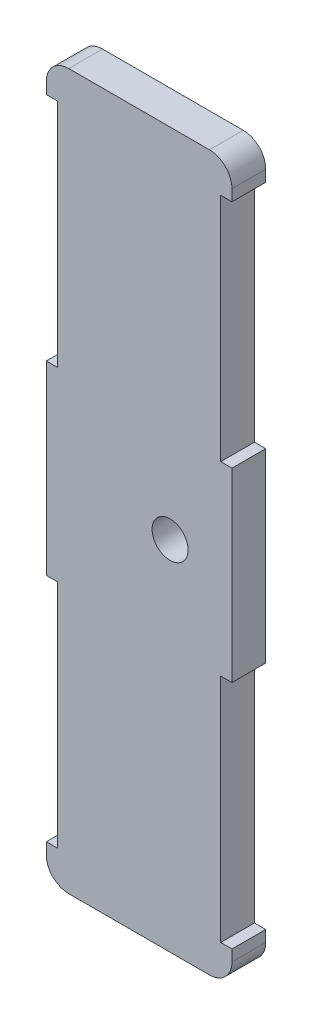
ISO-10303-21;
HEADER;
FILE_DESCRIPTION(('STEP AP214'),'2;1');
FILE_NAME('part.step','',(''),(''),'','','');
FILE_SCHEMA(('AUTOMOTIVE_DESIGN { 1 0 10303 214 1 1 1 1 }'));
ENDSEC;
DATA;
#1=APPLICATION_CONTEXT('core data for automotive mechanical design processes');
#2=APPLICATION_PROTOCOL_DEFINITION('international standard','automotive_design',2000,#1);
#3=PRODUCT_CONTEXT('',#1,'mechanical');
#4=PRODUCT('Part','Part','',(#3));
#5=PRODUCT_RELATED_PRODUCT_CATEGORY('part','',(#4));
#6=PRODUCT_DEFINITION_FORMATION('','',#4);
#7=PRODUCT_DEFINITION_CONTEXT('part definition',#1,'design');
#8=PRODUCT_DEFINITION('design','',#6,#7);
#9=PRODUCT_DEFINITION_SHAPE('','',#8);
#10=(LENGTH_UNIT() NAMED_UNIT(*) SI_UNIT(.MILLI.,.METRE.));
#11=(NAMED_UNIT(*) PLANE_ANGLE_UNIT() SI_UNIT($,.RADIAN.));
#12=(NAMED_UNIT(*) SI_UNIT($,.STERADIAN.) SOLID_ANGLE_UNIT());
#13=UNCERTAINTY_MEASURE_WITH_UNIT(LENGTH_MEASURE(1.E-05),#10,'distance_accuracy_value','');
#14=(GEOMETRIC_REPRESENTATION_CONTEXT(3) GLOBAL_UNCERTAINTY_ASSIGNED_CONTEXT((#13)) GLOBAL_UNIT_ASSIGNED_CONTEXT((#10,
#11,#12)) REPRESENTATION_CONTEXT('',''));
#15=CARTESIAN_POINT('',(0.,0.,0.));
#16=DIRECTION('',(0.,0.,1.));
#17=DIRECTION('',(1.,0.,0.));
#18=AXIS2_PLACEMENT_3D('',#15,#16,#17);
#19=CARTESIAN_POINT('',(0.,0.,3.));
#20=DIRECTION('',(0.,0.,-1.));
#21=DIRECTION('',(-1.,0.,0.));
#22=AXIS2_PLACEMENT_3D('',#19,#20,#21);
#23=PLANE('',#22);
#24=DIRECTION('',(-1.,0.,0.));
#25=VECTOR('',#24,1.);
#26=CARTESIAN_POINT('',(-61.,31.75,3.));
#27=LINE('',#26,#25);
#28=CARTESIAN_POINT('',(-46.5,31.75,3.));
#29=VERTEX_POINT('',#28);
#30=CARTESIAN_POINT('',(-59.,31.75,3.));
#31=VERTEX_POINT('',#30);
#32=EDGE_CURVE('E204',#29,#31,#27,.T.);
#33=ORIENTED_EDGE('',*,*,#32,.T.);
#34=CARTESIAN_POINT('',(-59.,29.75,3.));
#35=DIRECTION('',(0.,0.,-1.));
#36=DIRECTION('',(-1.,0.,0.));
#37=AXIS2_PLACEMENT_3D('',#34,#35,#36);
#38=CIRCLE('',#37,2.);
#39=CARTESIAN_POINT('',(-61.,29.75,3.));
#40=VERTEX_POINT('',#39);
#41=EDGE_CURVE('E200',#31,#40,#38,.F.);
#42=ORIENTED_EDGE('',*,*,#41,.T.);
#43=DIRECTION('',(0.,-1.,0.));
#44=VECTOR('',#43,1.);
#45=CARTESIAN_POINT('',(-61.,28.75,3.));
#46=LINE('',#45,#44);
#47=CARTESIAN_POINT('',(-61.,28.75,3.));
#48=VERTEX_POINT('',#47);
#49=EDGE_CURVE('E192',#40,#48,#46,.T.);
#50=ORIENTED_EDGE('',*,*,#49,.T.);
#51=DIRECTION('',(1.,0.,0.));
#52=VECTOR('',#51,1.);
#53=CARTESIAN_POINT('',(-61.,28.75,3.));
#54=LINE('',#53,#52);
#55=CARTESIAN_POINT('',(-60.,28.75,3.));
#56=VERTEX_POINT('',#55);
#57=EDGE_CURVE('E197',#48,#56,#54,.T.);
#58=ORIENTED_EDGE('',*,*,#57,.T.);
#59=DIRECTION('',(0.,-1.,0.));
#60=VECTOR('',#59,1.);
#61=CARTESIAN_POINT('',(-60.,28.75,3.));
#62=LINE('',#61,#60);
#63=CARTESIAN_POINT('',(-60.,8.25,3.));
#64=VERTEX_POINT('',#63);
#65=EDGE_CURVE('E219',#56,#64,#62,.T.);
#66=ORIENTED_EDGE('',*,*,#65,.T.);
#67=DIRECTION('',(-1.,0.,0.));
#68=VECTOR('',#67,1.);
#69=CARTESIAN_POINT('',(-60.,8.25,3.));
#70=LINE('',#69,#68);
#71=CARTESIAN_POINT('',(-61.,8.25,3.));
#72=VERTEX_POINT('',#71);
#73=EDGE_CURVE('E221',#64,#72,#70,.T.);
#74=ORIENTED_EDGE('',*,*,#73,.T.);
#75=DIRECTION('',(0.,-1.,0.));
#76=VECTOR('',#75,1.);
#77=CARTESIAN_POINT('',(-61.,-8.25,3.));
#78=LINE('',#77,#76);
#79=CARTESIAN_POINT('',(-61.,-8.25,3.));
#80=VERTEX_POINT('',#79);
#81=EDGE_CURVE('E226',#72,#80,#78,.T.);
#82=ORIENTED_EDGE('',*,*,#81,.T.);
#83=DIRECTION('',(1.,0.,0.));
#84=VECTOR('',#83,1.);
#85=CARTESIAN_POINT('',(-61.,-8.25,3.));
#86=LINE('',#85,#84);
#87=CARTESIAN_POINT('',(-60.,-8.25,3.));
#88=VERTEX_POINT('',#87);
#89=EDGE_CURVE('E228',#80,#88,#86,.T.);
#90=ORIENTED_EDGE('',*,*,#89,.T.);
#91=DIRECTION('',(0.,-1.,0.));
#92=VECTOR('',#91,1.);
#93=CARTESIAN_POINT('',(-60.,-8.25,3.));
#94=LINE('',#93,#92);
#95=CARTESIAN_POINT('',(-60.,-28.75,3.));
#96=VERTEX_POINT('',#95);
#97=EDGE_CURVE('E230',#88,#96,#94,.T.);
#98=ORIENTED_EDGE('',*,*,#97,.T.);
#99=DIRECTION('',(-1.,0.,0.));
#100=VECTOR('',#99,1.);
#101=CARTESIAN_POINT('',(-60.,-28.75,3.));
#102=LINE('',#101,#100);
#103=CARTESIAN_POINT('',(-61.,-28.75,3.));
#104=VERTEX_POINT('',#103);
#105=EDGE_CURVE('E232',#96,#104,#102,.T.);
#106=ORIENTED_EDGE('',*,*,#105,.T.);
#107=DIRECTION('',(0.,-1.,0.));
#108=VECTOR('',#107,1.);
#109=CARTESIAN_POINT('',(-61.,-31.75,3.));
#110=LINE('',#109,#108);
#111=CARTESIAN_POINT('',(-61.,-29.75,3.));
#112=VERTEX_POINT('',#111);
#113=EDGE_CURVE('E234',#104,#112,#110,.T.);
#114=ORIENTED_EDGE('',*,*,#113,.T.);
#115=CARTESIAN_POINT('',(-59.,-29.75,3.));
#116=DIRECTION('',(0.,0.,-1.));
#117=DIRECTION('',(-1.,0.,0.));
#118=AXIS2_PLACEMENT_3D('',#115,#116,#117);
#119=CIRCLE('',#118,2.);
#120=CARTESIAN_POINT('',(-59.,-31.75,3.));
#121=VERTEX_POINT('',#120);
#122=EDGE_CURVE('E356',#112,#121,#119,.F.);
#123=ORIENTED_EDGE('',*,*,#122,.T.);
#124=DIRECTION('',(1.,0.,0.));
#125=VECTOR('',#124,1.);
#126=CARTESIAN_POINT('',(-44.5,-31.75,3.));
#127=LINE('',#126,#125);
#128=CARTESIAN_POINT('',(-46.5,-31.75,3.));
#129=VERTEX_POINT('',#128);
#130=EDGE_CURVE('E237',#121,#129,#127,.T.);
#131=ORIENTED_EDGE('',*,*,#130,.T.);
#132=CARTESIAN_POINT('',(-46.5,-29.75,3.));
#133=DIRECTION('',(0.,0.,-1.));
#134=DIRECTION('',(-1.,0.,0.));
#135=AXIS2_PLACEMENT_3D('',#132,#133,#134);
#136=CIRCLE('',#135,2.);
#137=CARTESIAN_POINT('',(-44.5,-29.75,3.));
#138=VERTEX_POINT('',#137);
#139=EDGE_CURVE('E48',#129,#138,#136,.F.);
#140=ORIENTED_EDGE('',*,*,#139,.T.);
#141=DIRECTION('',(0.,1.,0.));
#142=VECTOR('',#141,1.);
#143=CARTESIAN_POINT('',(-44.5,-28.75,3.));
#144=LINE('',#143,#142);
#145=CARTESIAN_POINT('',(-44.5,-28.75,3.));
#146=VERTEX_POINT('',#145);
#147=EDGE_CURVE('E239',#138,#146,#144,.T.);
#148=ORIENTED_EDGE('',*,*,#147,.T.);
#149=DIRECTION('',(-1.,0.,0.));
#150=VECTOR('',#149,1.);
#151=CARTESIAN_POINT('',(-45.5,-28.75,3.));
#152=LINE('',#151,#150);
#153=CARTESIAN_POINT('',(-45.5,-28.75,3.));
#154=VERTEX_POINT('',#153);
#155=EDGE_CURVE('E241',#146,#154,#152,.T.);
#156=ORIENTED_EDGE('',*,*,#155,.T.);
#157=DIRECTION('',(0.,1.,0.));
#158=VECTOR('',#157,1.);
#159=CARTESIAN_POINT('',(-45.5,-8.25,3.));
#160=LINE('',#159,#158);
#161=CARTESIAN_POINT('',(-45.5,-8.25,3.));
#162=VERTEX_POINT('',#161);
#163=EDGE_CURVE('E243',#154,#162,#160,.T.);
#164=ORIENTED_EDGE('',*,*,#163,.T.);
#165=DIRECTION('',(1.,0.,0.));
#166=VECTOR('',#165,1.);
#167=CARTESIAN_POINT('',(-44.5,-8.25,3.));
#168=LINE('',#167,#166);
#169=CARTESIAN_POINT('',(-44.5,-8.25,3.));
#170=VERTEX_POINT('',#169);
#171=EDGE_CURVE('E245',#162,#170,#168,.T.);
#172=ORIENTED_EDGE('',*,*,#171,.T.);
#173=DIRECTION('',(0.,1.,0.));
#174=VECTOR('',#173,1.);
#175=CARTESIAN_POINT('',(-44.5,8.25,3.));
#176=LINE('',#175,#174);
#177=CARTESIAN_POINT('',(-44.5,8.25,3.));
#178=VERTEX_POINT('',#177);
#179=EDGE_CURVE('E247',#170,#178,#176,.T.);
#180=ORIENTED_EDGE('',*,*,#179,.T.);
#181=DIRECTION('',(-1.,0.,0.));
#182=VECTOR('',#181,1.);
#183=CARTESIAN_POINT('',(-45.5,8.25,3.));
#184=LINE('',#183,#182);
#185=CARTESIAN_POINT('',(-45.5,8.25,3.));
#186=VERTEX_POINT('',#185);
#187=EDGE_CURVE('E249',#178,#186,#184,.T.);
#188=ORIENTED_EDGE('',*,*,#187,.T.);
#189=DIRECTION('',(0.,1.,0.));
#190=VECTOR('',#189,1.);
#191=CARTESIAN_POINT('',(-45.5,28.75,3.));
#192=LINE('',#191,#190);
#193=CARTESIAN_POINT('',(-45.5,28.75,3.));
#194=VERTEX_POINT('',#193);
#195=EDGE_CURVE('E251',#186,#194,#192,.T.);
#196=ORIENTED_EDGE('',*,*,#195,.T.);
#197=DIRECTION('',(1.,0.,0.));
#198=VECTOR('',#197,1.);
#199=CARTESIAN_POINT('',(-45.5,28.75,3.));
#200=LINE('',#199,#198);
#201=CARTESIAN_POINT('',(-44.5,28.75,3.));
#202=VERTEX_POINT('',#201);
#203=EDGE_CURVE('E253',#194,#202,#200,.T.);
#204=ORIENTED_EDGE('',*,*,#203,.T.);
#205=DIRECTION('',(0.,1.,0.));
#206=VECTOR('',#205,1.);
#207=CARTESIAN_POINT('',(-44.5,28.75,3.));
#208=LINE('',#207,#206);
#209=CARTESIAN_POINT('',(-44.5,29.75,3.));
#210=VERTEX_POINT('',#209);
#211=EDGE_CURVE('E299',#202,#210,#208,.T.);
#212=ORIENTED_EDGE('',*,*,#211,.T.);
#213=CARTESIAN_POINT('',(-46.5,29.75,3.));
#214=DIRECTION('',(0.,0.,-1.));
#215=DIRECTION('',(-1.,0.,0.));
#216=AXIS2_PLACEMENT_3D('',#213,#214,#215);
#217=CIRCLE('',#216,2.);
#218=EDGE_CURVE('E359',#210,#29,#217,.F.);
#219=ORIENTED_EDGE('',*,*,#218,.T.);
#220=EDGE_LOOP('',(#33,#42,#50,#58,#66,#74,#82,#90,#98,#106,#114,#123,#131,#140,#148,#156,#164,
#172,#180,#188,#196,#204,#212,#219));
#221=FACE_BOUND('',#220,.T.);
#222=CARTESIAN_POINT('',(-50.,0.,3.));
#223=DIRECTION('',(0.,0.,1.));
#224=DIRECTION('',(1.,0.,0.));
#225=AXIS2_PLACEMENT_3D('',#222,#223,#224);
#226=CIRCLE('',#225,1.60000000000001);
#227=CARTESIAN_POINT('',(-48.4,0.,3.));
#228=VERTEX_POINT('',#227);
#229=EDGE_CURVE('E260',#228,#228,#226,.T.);
#230=ORIENTED_EDGE('',*,*,#229,.F.);
#231=EDGE_LOOP('',(#230));
#232=FACE_BOUND('',#231,.T.);
#233=ADVANCED_FACE('F33',(#221,#232),#23,.F.);
#234=CARTESIAN_POINT('',(0.,0.,0.));
#235=DIRECTION('',(0.,0.,-1.));
#236=DIRECTION('',(-1.,0.,0.));
#237=AXIS2_PLACEMENT_3D('',#234,#235,#236);
#238=PLANE('',#237);
#239=DIRECTION('',(0.,-1.,0.));
#240=VECTOR('',#239,1.);
#241=CARTESIAN_POINT('',(-61.,28.75,0.));
#242=LINE('',#241,#240);
#243=CARTESIAN_POINT('',(-61.,29.75,0.));
#244=VERTEX_POINT('',#243);
#245=CARTESIAN_POINT('',(-61.,28.75,0.));
#246=VERTEX_POINT('',#245);
#247=EDGE_CURVE('E210',#244,#246,#242,.T.);
#248=ORIENTED_EDGE('',*,*,#247,.F.);
#249=CARTESIAN_POINT('',(-59.,29.75,0.));
#250=DIRECTION('',(0.,0.,-1.));
#251=DIRECTION('',(-1.,0.,0.));
#252=AXIS2_PLACEMENT_3D('',#249,#250,#251);
#253=CIRCLE('',#252,2.);
#254=CARTESIAN_POINT('',(-59.,31.75,0.));
#255=VERTEX_POINT('',#254);
#256=EDGE_CURVE('E349',#244,#255,#253,.T.);
#257=ORIENTED_EDGE('',*,*,#256,.T.);
#258=DIRECTION('',(-1.,0.,0.));
#259=VECTOR('',#258,1.);
#260=CARTESIAN_POINT('',(-61.,31.75,0.));
#261=LINE('',#260,#259);
#262=CARTESIAN_POINT('',(-46.5,31.75,0.));
#263=VERTEX_POINT('',#262);
#264=EDGE_CURVE('E259',#263,#255,#261,.T.);
#265=ORIENTED_EDGE('',*,*,#264,.F.);
#266=CARTESIAN_POINT('',(-46.5,29.75,0.));
#267=DIRECTION('',(0.,0.,-1.));
#268=DIRECTION('',(-1.,0.,0.));
#269=AXIS2_PLACEMENT_3D('',#266,#267,#268);
#270=CIRCLE('',#269,2.);
#271=CARTESIAN_POINT('',(-44.5,29.75,0.));
#272=VERTEX_POINT('',#271);
#273=EDGE_CURVE('E347',#263,#272,#270,.T.);
#274=ORIENTED_EDGE('',*,*,#273,.T.);
#275=DIRECTION('',(0.,1.,0.));
#276=VECTOR('',#275,1.);
#277=CARTESIAN_POINT('',(-44.5,28.75,0.));
#278=LINE('',#277,#276);
#279=CARTESIAN_POINT('',(-44.5,28.75,0.));
#280=VERTEX_POINT('',#279);
#281=EDGE_CURVE('E256',#280,#272,#278,.T.);
#282=ORIENTED_EDGE('',*,*,#281,.F.);
#283=DIRECTION('',(1.,0.,0.));
#284=VECTOR('',#283,1.);
#285=CARTESIAN_POINT('',(-45.5,28.75,0.));
#286=LINE('',#285,#284);
#287=CARTESIAN_POINT('',(-45.5,28.75,0.));
#288=VERTEX_POINT('',#287);
#289=EDGE_CURVE('E297',#288,#280,#286,.T.);
#290=ORIENTED_EDGE('',*,*,#289,.F.);
#291=DIRECTION('',(0.,1.,0.));
#292=VECTOR('',#291,1.);
#293=CARTESIAN_POINT('',(-45.5,28.75,0.));
#294=LINE('',#293,#292);
#295=CARTESIAN_POINT('',(-45.5,8.25,0.));
#296=VERTEX_POINT('',#295);
#297=EDGE_CURVE('E295',#296,#288,#294,.T.);
#298=ORIENTED_EDGE('',*,*,#297,.F.);
#299=DIRECTION('',(-1.,0.,0.));
#300=VECTOR('',#299,1.);
#301=CARTESIAN_POINT('',(-45.5,8.25,0.));
#302=LINE('',#301,#300);
#303=CARTESIAN_POINT('',(-44.5,8.25,0.));
#304=VERTEX_POINT('',#303);
#305=EDGE_CURVE('E293',#304,#296,#302,.T.);
#306=ORIENTED_EDGE('',*,*,#305,.F.);
#307=DIRECTION('',(0.,1.,0.));
#308=VECTOR('',#307,1.);
#309=CARTESIAN_POINT('',(-44.5,8.25,0.));
#310=LINE('',#309,#308);
#311=CARTESIAN_POINT('',(-44.5,-8.25,0.));
#312=VERTEX_POINT('',#311);
#313=EDGE_CURVE('E291',#312,#304,#310,.T.);
#314=ORIENTED_EDGE('',*,*,#313,.F.);
#315=DIRECTION('',(1.,0.,0.));
#316=VECTOR('',#315,1.);
#317=CARTESIAN_POINT('',(-44.5,-8.25,0.));
#318=LINE('',#317,#316);
#319=CARTESIAN_POINT('',(-45.5,-8.25,0.));
#320=VERTEX_POINT('',#319);
#321=EDGE_CURVE('E289',#320,#312,#318,.T.);
#322=ORIENTED_EDGE('',*,*,#321,.F.);
#323=DIRECTION('',(0.,1.,0.));
#324=VECTOR('',#323,1.);
#325=CARTESIAN_POINT('',(-45.5,-8.25,0.));
#326=LINE('',#325,#324);
#327=CARTESIAN_POINT('',(-45.5,-28.75,0.));
#328=VERTEX_POINT('',#327);
#329=EDGE_CURVE('E287',#328,#320,#326,.T.);
#330=ORIENTED_EDGE('',*,*,#329,.F.);
#331=DIRECTION('',(-1.,0.,0.));
#332=VECTOR('',#331,1.);
#333=CARTESIAN_POINT('',(-45.5,-28.75,0.));
#334=LINE('',#333,#332);
#335=CARTESIAN_POINT('',(-44.5,-28.75,0.));
#336=VERTEX_POINT('',#335);
#337=EDGE_CURVE('E285',#336,#328,#334,.T.);
#338=ORIENTED_EDGE('',*,*,#337,.F.);
#339=DIRECTION('',(0.,1.,0.));
#340=VECTOR('',#339,1.);
#341=CARTESIAN_POINT('',(-44.5,-28.75,0.));
#342=LINE('',#341,#340);
#343=CARTESIAN_POINT('',(-44.5,-29.75,0.));
#344=VERTEX_POINT('',#343);
#345=EDGE_CURVE('E283',#344,#336,#342,.T.);
#346=ORIENTED_EDGE('',*,*,#345,.F.);
#347=CARTESIAN_POINT('',(-46.5,-29.75,0.));
#348=DIRECTION('',(0.,0.,-1.));
#349=DIRECTION('',(-1.,0.,0.));
#350=AXIS2_PLACEMENT_3D('',#347,#348,#349);
#351=CIRCLE('',#350,2.);
#352=CARTESIAN_POINT('',(-46.5,-31.75,0.));
#353=VERTEX_POINT('',#352);
#354=EDGE_CURVE('E345',#344,#353,#351,.T.);
#355=ORIENTED_EDGE('',*,*,#354,.T.);
#356=DIRECTION('',(1.,0.,0.));
#357=VECTOR('',#356,1.);
#358=CARTESIAN_POINT('',(-44.5,-31.75,0.));
#359=LINE('',#358,#357);
#360=CARTESIAN_POINT('',(-59.,-31.75,0.));
#361=VERTEX_POINT('',#360);
#362=EDGE_CURVE('E281',#361,#353,#359,.T.);
#363=ORIENTED_EDGE('',*,*,#362,.F.);
#364=CARTESIAN_POINT('',(-59.,-29.75,0.));
#365=DIRECTION('',(0.,0.,-1.));
#366=DIRECTION('',(-1.,0.,0.));
#367=AXIS2_PLACEMENT_3D('',#364,#365,#366);
#368=CIRCLE('',#367,2.);
#369=CARTESIAN_POINT('',(-61.,-29.75,0.));
#370=VERTEX_POINT('',#369);
#371=EDGE_CURVE('E343',#361,#370,#368,.T.);
#372=ORIENTED_EDGE('',*,*,#371,.T.);
#373=DIRECTION('',(0.,-1.,0.));
#374=VECTOR('',#373,1.);
#375=CARTESIAN_POINT('',(-61.,-31.75,0.));
#376=LINE('',#375,#374);
#377=CARTESIAN_POINT('',(-61.,-28.75,0.));
#378=VERTEX_POINT('',#377);
#379=EDGE_CURVE('E278',#378,#370,#376,.T.);
#380=ORIENTED_EDGE('',*,*,#379,.F.);
#381=DIRECTION('',(-1.,0.,0.));
#382=VECTOR('',#381,1.);
#383=CARTESIAN_POINT('',(-60.,-28.75,0.));
#384=LINE('',#383,#382);
#385=CARTESIAN_POINT('',(-60.,-28.75,0.));
#386=VERTEX_POINT('',#385);
#387=EDGE_CURVE('E276',#386,#378,#384,.T.);
#388=ORIENTED_EDGE('',*,*,#387,.F.);
#389=DIRECTION('',(0.,-1.,0.));
#390=VECTOR('',#389,1.);
#391=CARTESIAN_POINT('',(-60.,-8.25,0.));
#392=LINE('',#391,#390);
#393=CARTESIAN_POINT('',(-60.,-8.25,0.));
#394=VERTEX_POINT('',#393);
#395=EDGE_CURVE('E274',#394,#386,#392,.T.);
#396=ORIENTED_EDGE('',*,*,#395,.F.);
#397=DIRECTION('',(1.,0.,0.));
#398=VECTOR('',#397,1.);
#399=CARTESIAN_POINT('',(-61.,-8.25,0.));
#400=LINE('',#399,#398);
#401=CARTESIAN_POINT('',(-61.,-8.25,0.));
#402=VERTEX_POINT('',#401);
#403=EDGE_CURVE('E272',#402,#394,#400,.T.);
#404=ORIENTED_EDGE('',*,*,#403,.F.);
#405=DIRECTION('',(0.,-1.,0.));
#406=VECTOR('',#405,1.);
#407=CARTESIAN_POINT('',(-61.,-8.25,0.));
#408=LINE('',#407,#406);
#409=CARTESIAN_POINT('',(-61.,8.25,0.));
#410=VERTEX_POINT('',#409);
#411=EDGE_CURVE('E270',#410,#402,#408,.T.);
#412=ORIENTED_EDGE('',*,*,#411,.F.);
#413=DIRECTION('',(-1.,0.,0.));
#414=VECTOR('',#413,1.);
#415=CARTESIAN_POINT('',(-60.,8.25,0.));
#416=LINE('',#415,#414);
#417=CARTESIAN_POINT('',(-60.,8.25,0.));
#418=VERTEX_POINT('',#417);
#419=EDGE_CURVE('E268',#418,#410,#416,.T.);
#420=ORIENTED_EDGE('',*,*,#419,.F.);
#421=DIRECTION('',(0.,-1.,0.));
#422=VECTOR('',#421,1.);
#423=CARTESIAN_POINT('',(-60.,28.75,0.));
#424=LINE('',#423,#422);
#425=CARTESIAN_POINT('',(-60.,28.75,0.));
#426=VERTEX_POINT('',#425);
#427=EDGE_CURVE('E266',#426,#418,#424,.T.);
#428=ORIENTED_EDGE('',*,*,#427,.F.);
#429=DIRECTION('',(1.,0.,0.));
#430=VECTOR('',#429,1.);
#431=CARTESIAN_POINT('',(-61.,28.75,0.));
#432=LINE('',#431,#430);
#433=EDGE_CURVE('E264',#246,#426,#432,.T.);
#434=ORIENTED_EDGE('',*,*,#433,.F.);
#435=EDGE_LOOP('',(#248,#257,#265,#274,#282,#290,#298,#306,#314,#322,#330,#338,#346,#355,#363,
#372,#380,#388,#396,#404,#412,#420,#428,#434));
#436=FACE_BOUND('',#435,.T.);
#437=CARTESIAN_POINT('',(-50.,0.,0.));
#438=DIRECTION('',(0.,0.,1.));
#439=DIRECTION('',(1.,0.,0.));
#440=AXIS2_PLACEMENT_3D('',#437,#438,#439);
#441=CIRCLE('',#440,1.60000000000001);
#442=CARTESIAN_POINT('',(-48.4,0.,0.));
#443=VERTEX_POINT('',#442);
#444=EDGE_CURVE('E429',#443,#443,#441,.T.);
#445=ORIENTED_EDGE('',*,*,#444,.T.);
#446=EDGE_LOOP('',(#445));
#447=FACE_BOUND('',#446,.T.);
#448=ADVANCED_FACE('F375',(#436,#447),#238,.T.);
#449=CARTESIAN_POINT('',(-44.5,28.75,3.));
#450=DIRECTION('',(-1.,0.,0.));
#451=DIRECTION('',(0.,-1.,0.));
#452=AXIS2_PLACEMENT_3D('',#449,#450,#451);
#453=PLANE('',#452);
#454=ORIENTED_EDGE('',*,*,#281,.T.);
#455=DIRECTION('',(0.,0.,-1.));
#456=VECTOR('',#455,1.);
#457=CARTESIAN_POINT('',(-44.5,29.75,3.));
#458=LINE('',#457,#456);
#459=EDGE_CURVE('E362',#272,#210,#458,.F.);
#460=ORIENTED_EDGE('',*,*,#459,.T.);
#461=ORIENTED_EDGE('',*,*,#211,.F.);
#462=DIRECTION('',(0.,0.,-1.));
#463=VECTOR('',#462,1.);
#464=CARTESIAN_POINT('',(-44.5,28.75,3.));
#465=LINE('',#464,#463);
#466=EDGE_CURVE('E255',#202,#280,#465,.T.);
#467=ORIENTED_EDGE('',*,*,#466,.T.);
#468=EDGE_LOOP('',(#454,#460,#461,#467));
#469=FACE_BOUND('',#468,.T.);
#470=ADVANCED_FACE('F425',(#469),#453,.F.);
#471=CARTESIAN_POINT('',(-61.,31.75,3.));
#472=DIRECTION('',(0.,-1.,0.));
#473=DIRECTION('',(0.,0.,-1.));
#474=AXIS2_PLACEMENT_3D('',#471,#472,#473);
#475=PLANE('',#474);
#476=ORIENTED_EDGE('',*,*,#264,.T.);
#477=DIRECTION('',(0.,0.,-1.));
#478=VECTOR('',#477,1.);
#479=CARTESIAN_POINT('',(-59.,31.75,3.));
#480=LINE('',#479,#478);
#481=EDGE_CURVE('E354',#255,#31,#480,.F.);
#482=ORIENTED_EDGE('',*,*,#481,.T.);
#483=ORIENTED_EDGE('',*,*,#32,.F.);
#484=DIRECTION('',(0.,0.,-1.));
#485=VECTOR('',#484,1.);
#486=CARTESIAN_POINT('',(-46.5,31.75,3.));
#487=LINE('',#486,#485);
#488=EDGE_CURVE('E351',#29,#263,#487,.T.);
#489=ORIENTED_EDGE('',*,*,#488,.T.);
#490=EDGE_LOOP('',(#476,#482,#483,#489));
#491=FACE_BOUND('',#490,.T.);
#492=ADVANCED_FACE('F495',(#491),#475,.F.);
#493=CARTESIAN_POINT('',(-61.,28.75,3.));
#494=DIRECTION('',(1.,0.,0.));
#495=DIRECTION('',(0.,0.,-1.));
#496=AXIS2_PLACEMENT_3D('',#493,#494,#495);
#497=PLANE('',#496);
#498=ORIENTED_EDGE('',*,*,#49,.F.);
#499=DIRECTION('',(0.,0.,-1.));
#500=VECTOR('',#499,1.);
#501=CARTESIAN_POINT('',(-61.,29.75,3.));
#502=LINE('',#501,#500);
#503=EDGE_CURVE('E213',#40,#244,#502,.T.);
#504=ORIENTED_EDGE('',*,*,#503,.T.);
#505=ORIENTED_EDGE('',*,*,#247,.T.);
#506=DIRECTION('',(0.,0.,-1.));
#507=VECTOR('',#506,1.);
#508=CARTESIAN_POINT('',(-61.,28.75,3.));
#509=LINE('',#508,#507);
#510=EDGE_CURVE('E207',#48,#246,#509,.T.);
#511=ORIENTED_EDGE('',*,*,#510,.F.);
#512=EDGE_LOOP('',(#498,#504,#505,#511));
#513=FACE_BOUND('',#512,.T.);
#514=ADVANCED_FACE('F208',(#513),#497,.F.);
#515=CARTESIAN_POINT('',(-61.,28.75,3.));
#516=DIRECTION('',(0.,1.,0.));
#517=DIRECTION('',(0.,0.,1.));
#518=AXIS2_PLACEMENT_3D('',#515,#516,#517);
#519=PLANE('',#518);
#520=ORIENTED_EDGE('',*,*,#433,.T.);
#521=DIRECTION('',(0.,0.,-1.));
#522=VECTOR('',#521,1.);
#523=CARTESIAN_POINT('',(-60.,28.75,3.));
#524=LINE('',#523,#522);
#525=EDGE_CURVE('E214',#56,#426,#524,.T.);
#526=ORIENTED_EDGE('',*,*,#525,.F.);
#527=ORIENTED_EDGE('',*,*,#57,.F.);
#528=ORIENTED_EDGE('',*,*,#510,.T.);
#529=EDGE_LOOP('',(#520,#526,#527,#528));
#530=FACE_BOUND('',#529,.T.);
#531=ADVANCED_FACE('F216',(#530),#519,.F.);
#532=CARTESIAN_POINT('',(-60.,28.75,3.));
#533=DIRECTION('',(1.,0.,0.));
#534=DIRECTION('',(0.,0.,-1.));
#535=AXIS2_PLACEMENT_3D('',#532,#533,#534);
#536=PLANE('',#535);
#537=ORIENTED_EDGE('',*,*,#427,.T.);
#538=DIRECTION('',(0.,0.,-1.));
#539=VECTOR('',#538,1.);
#540=CARTESIAN_POINT('',(-60.,8.25,3.));
#541=LINE('',#540,#539);
#542=EDGE_CURVE('E338',#64,#418,#541,.T.);
#543=ORIENTED_EDGE('',*,*,#542,.F.);
#544=ORIENTED_EDGE('',*,*,#65,.F.);
#545=ORIENTED_EDGE('',*,*,#525,.T.);
#546=EDGE_LOOP('',(#537,#543,#544,#545));
#547=FACE_BOUND('',#546,.T.);
#548=ADVANCED_FACE('F486',(#547),#536,.F.);
#549=CARTESIAN_POINT('',(-60.,8.25,3.));
#550=DIRECTION('',(0.,-1.,0.));
#551=DIRECTION('',(0.,0.,-1.));
#552=AXIS2_PLACEMENT_3D('',#549,#550,#551);
#553=PLANE('',#552);
#554=ORIENTED_EDGE('',*,*,#419,.T.);
#555=DIRECTION('',(0.,0.,-1.));
#556=VECTOR('',#555,1.);
#557=CARTESIAN_POINT('',(-61.,8.25,3.));
#558=LINE('',#557,#556);
#559=EDGE_CURVE('E335',#72,#410,#558,.T.);
#560=ORIENTED_EDGE('',*,*,#559,.F.);
#561=ORIENTED_EDGE('',*,*,#73,.F.);
#562=ORIENTED_EDGE('',*,*,#542,.T.);
#563=EDGE_LOOP('',(#554,#560,#561,#562));
#564=FACE_BOUND('',#563,.T.);
#565=ADVANCED_FACE('F482',(#564),#553,.F.);
#566=CARTESIAN_POINT('',(-61.,-8.25,3.));
#567=DIRECTION('',(1.,0.,0.));
#568=DIRECTION('',(0.,0.,-1.));
#569=AXIS2_PLACEMENT_3D('',#566,#567,#568);
#570=PLANE('',#569);
#571=ORIENTED_EDGE('',*,*,#411,.T.);
#572=DIRECTION('',(0.,0.,-1.));
#573=VECTOR('',#572,1.);
#574=CARTESIAN_POINT('',(-61.,-8.25,3.));
#575=LINE('',#574,#573);
#576=EDGE_CURVE('E332',#80,#402,#575,.T.);
#577=ORIENTED_EDGE('',*,*,#576,.F.);
#578=ORIENTED_EDGE('',*,*,#81,.F.);
#579=ORIENTED_EDGE('',*,*,#559,.T.);
#580=EDGE_LOOP('',(#571,#577,#578,#579));
#581=FACE_BOUND('',#580,.T.);
#582=ADVANCED_FACE('F478',(#581),#570,.F.);
#583=CARTESIAN_POINT('',(-61.,-8.25,3.));
#584=DIRECTION('',(0.,1.,0.));
#585=DIRECTION('',(0.,0.,1.));
#586=AXIS2_PLACEMENT_3D('',#583,#584,#585);
#587=PLANE('',#586);
#588=ORIENTED_EDGE('',*,*,#403,.T.);
#589=DIRECTION('',(0.,0.,-1.));
#590=VECTOR('',#589,1.);
#591=CARTESIAN_POINT('',(-60.,-8.25,3.));
#592=LINE('',#591,#590);
#593=EDGE_CURVE('E329',#88,#394,#592,.T.);
#594=ORIENTED_EDGE('',*,*,#593,.F.);
#595=ORIENTED_EDGE('',*,*,#89,.F.);
#596=ORIENTED_EDGE('',*,*,#576,.T.);
#597=EDGE_LOOP('',(#588,#594,#595,#596));
#598=FACE_BOUND('',#597,.T.);
#599=ADVANCED_FACE('F474',(#598),#587,.F.);
#600=CARTESIAN_POINT('',(-60.,-8.25,3.));
#601=DIRECTION('',(1.,0.,0.));
#602=DIRECTION('',(0.,0.,-1.));
#603=AXIS2_PLACEMENT_3D('',#600,#601,#602);
#604=PLANE('',#603);
#605=ORIENTED_EDGE('',*,*,#395,.T.);
#606=DIRECTION('',(0.,0.,-1.));
#607=VECTOR('',#606,1.);
#608=CARTESIAN_POINT('',(-60.,-28.75,3.));
#609=LINE('',#608,#607);
#610=EDGE_CURVE('E326',#96,#386,#609,.T.);
#611=ORIENTED_EDGE('',*,*,#610,.F.);
#612=ORIENTED_EDGE('',*,*,#97,.F.);
#613=ORIENTED_EDGE('',*,*,#593,.T.);
#614=EDGE_LOOP('',(#605,#611,#612,#613));
#615=FACE_BOUND('',#614,.T.);
#616=ADVANCED_FACE('F470',(#615),#604,.F.);
#617=CARTESIAN_POINT('',(-60.,-28.75,3.));
#618=DIRECTION('',(0.,-1.,0.));
#619=DIRECTION('',(0.,0.,-1.));
#620=AXIS2_PLACEMENT_3D('',#617,#618,#619);
#621=PLANE('',#620);
#622=ORIENTED_EDGE('',*,*,#387,.T.);
#623=DIRECTION('',(0.,0.,-1.));
#624=VECTOR('',#623,1.);
#625=CARTESIAN_POINT('',(-61.,-28.75,3.));
#626=LINE('',#625,#624);
#627=EDGE_CURVE('E323',#104,#378,#626,.T.);
#628=ORIENTED_EDGE('',*,*,#627,.F.);
#629=ORIENTED_EDGE('',*,*,#105,.F.);
#630=ORIENTED_EDGE('',*,*,#610,.T.);
#631=EDGE_LOOP('',(#622,#628,#629,#630));
#632=FACE_BOUND('',#631,.T.);
#633=ADVANCED_FACE('F466',(#632),#621,.F.);
#634=CARTESIAN_POINT('',(-61.,-31.75,3.));
#635=DIRECTION('',(1.,0.,0.));
#636=DIRECTION('',(0.,0.,-1.));
#637=AXIS2_PLACEMENT_3D('',#634,#635,#636);
#638=PLANE('',#637);
#639=ORIENTED_EDGE('',*,*,#379,.T.);
#640=DIRECTION('',(0.,0.,-1.));
#641=VECTOR('',#640,1.);
#642=CARTESIAN_POINT('',(-61.,-29.75,3.));
#643=LINE('',#642,#641);
#644=EDGE_CURVE('E11',#370,#112,#643,.F.);
#645=ORIENTED_EDGE('',*,*,#644,.T.);
#646=ORIENTED_EDGE('',*,*,#113,.F.);
#647=ORIENTED_EDGE('',*,*,#627,.T.);
#648=EDGE_LOOP('',(#639,#645,#646,#647));
#649=FACE_BOUND('',#648,.T.);
#650=ADVANCED_FACE('F463',(#649),#638,.F.);
#651=CARTESIAN_POINT('',(-44.5,-31.75,3.));
#652=DIRECTION('',(0.,1.,0.));
#653=DIRECTION('',(0.,0.,1.));
#654=AXIS2_PLACEMENT_3D('',#651,#652,#653);
#655=PLANE('',#654);
#656=ORIENTED_EDGE('',*,*,#362,.T.);
#657=DIRECTION('',(0.,0.,-1.));
#658=VECTOR('',#657,1.);
#659=CARTESIAN_POINT('',(-46.5,-31.75,3.));
#660=LINE('',#659,#658);
#661=EDGE_CURVE('E41',#353,#129,#660,.F.);
#662=ORIENTED_EDGE('',*,*,#661,.T.);
#663=ORIENTED_EDGE('',*,*,#130,.F.);
#664=DIRECTION('',(0.,0.,-1.));
#665=VECTOR('',#664,1.);
#666=CARTESIAN_POINT('',(-59.,-31.75,3.));
#667=LINE('',#666,#665);
#668=EDGE_CURVE('E367',#121,#361,#667,.T.);
#669=ORIENTED_EDGE('',*,*,#668,.T.);
#670=EDGE_LOOP('',(#656,#662,#663,#669));
#671=FACE_BOUND('',#670,.T.);
#672=ADVANCED_FACE('F371',(#671),#655,.F.);
#673=CARTESIAN_POINT('',(-44.5,-28.75,3.));
#674=DIRECTION('',(-1.,0.,0.));
#675=DIRECTION('',(0.,0.,1.));
#676=AXIS2_PLACEMENT_3D('',#673,#674,#675);
#677=PLANE('',#676);
#678=ORIENTED_EDGE('',*,*,#147,.F.);
#679=DIRECTION('',(0.,0.,-1.));
#680=VECTOR('',#679,1.);
#681=CARTESIAN_POINT('',(-44.5,-29.75,3.));
#682=LINE('',#681,#680);
#683=EDGE_CURVE('E364',#138,#344,#682,.T.);
#684=ORIENTED_EDGE('',*,*,#683,.T.);
#685=ORIENTED_EDGE('',*,*,#345,.T.);
#686=DIRECTION('',(0.,0.,-1.));
#687=VECTOR('',#686,1.);
#688=CARTESIAN_POINT('',(-44.5,-28.75,3.));
#689=LINE('',#688,#687);
#690=EDGE_CURVE('E320',#146,#336,#689,.T.);
#691=ORIENTED_EDGE('',*,*,#690,.F.);
#692=EDGE_LOOP('',(#678,#684,#685,#691));
#693=FACE_BOUND('',#692,.T.);
#694=ADVANCED_FACE('F384',(#693),#677,.F.);
#695=CARTESIAN_POINT('',(-45.5,-28.75,3.));
#696=DIRECTION('',(0.,-1.,0.));
#697=DIRECTION('',(1.,0.,0.));
#698=AXIS2_PLACEMENT_3D('',#695,#696,#697);
#699=PLANE('',#698);
#700=ORIENTED_EDGE('',*,*,#337,.T.);
#701=DIRECTION('',(0.,0.,-1.));
#702=VECTOR('',#701,1.);
#703=CARTESIAN_POINT('',(-45.5,-28.75,3.));
#704=LINE('',#703,#702);
#705=EDGE_CURVE('E317',#154,#328,#704,.T.);
#706=ORIENTED_EDGE('',*,*,#705,.F.);
#707=ORIENTED_EDGE('',*,*,#155,.F.);
#708=ORIENTED_EDGE('',*,*,#690,.T.);
#709=EDGE_LOOP('',(#700,#706,#707,#708));
#710=FACE_BOUND('',#709,.T.);
#711=ADVANCED_FACE('F391',(#710),#699,.F.);
#712=CARTESIAN_POINT('',(-45.5,-8.25,3.));
#713=DIRECTION('',(-1.,0.,0.));
#714=DIRECTION('',(0.,0.,1.));
#715=AXIS2_PLACEMENT_3D('',#712,#713,#714);
#716=PLANE('',#715);
#717=ORIENTED_EDGE('',*,*,#329,.T.);
#718=DIRECTION('',(0.,0.,-1.));
#719=VECTOR('',#718,1.);
#720=CARTESIAN_POINT('',(-45.5,-8.25,3.));
#721=LINE('',#720,#719);
#722=EDGE_CURVE('E314',#162,#320,#721,.T.);
#723=ORIENTED_EDGE('',*,*,#722,.F.);
#724=ORIENTED_EDGE('',*,*,#163,.F.);
#725=ORIENTED_EDGE('',*,*,#705,.T.);
#726=EDGE_LOOP('',(#717,#723,#724,#725));
#727=FACE_BOUND('',#726,.T.);
#728=ADVANCED_FACE('F394',(#727),#716,.F.);
#729=CARTESIAN_POINT('',(-44.5,-8.25,3.));
#730=DIRECTION('',(0.,1.,0.));
#731=DIRECTION('',(0.,0.,1.));
#732=AXIS2_PLACEMENT_3D('',#729,#730,#731);
#733=PLANE('',#732);
#734=ORIENTED_EDGE('',*,*,#321,.T.);
#735=DIRECTION('',(0.,0.,-1.));
#736=VECTOR('',#735,1.);
#737=CARTESIAN_POINT('',(-44.5,-8.25,3.));
#738=LINE('',#737,#736);
#739=EDGE_CURVE('E311',#170,#312,#738,.T.);
#740=ORIENTED_EDGE('',*,*,#739,.F.);
#741=ORIENTED_EDGE('',*,*,#171,.F.);
#742=ORIENTED_EDGE('',*,*,#722,.T.);
#743=EDGE_LOOP('',(#734,#740,#741,#742));
#744=FACE_BOUND('',#743,.T.);
#745=ADVANCED_FACE('F399',(#744),#733,.F.);
#746=CARTESIAN_POINT('',(-44.5,8.25,3.));
#747=DIRECTION('',(-1.,0.,0.));
#748=DIRECTION('',(0.,0.,1.));
#749=AXIS2_PLACEMENT_3D('',#746,#747,#748);
#750=PLANE('',#749);
#751=ORIENTED_EDGE('',*,*,#313,.T.);
#752=DIRECTION('',(0.,0.,-1.));
#753=VECTOR('',#752,1.);
#754=CARTESIAN_POINT('',(-44.5,8.25,3.));
#755=LINE('',#754,#753);
#756=EDGE_CURVE('E308',#178,#304,#755,.T.);
#757=ORIENTED_EDGE('',*,*,#756,.F.);
#758=ORIENTED_EDGE('',*,*,#179,.F.);
#759=ORIENTED_EDGE('',*,*,#739,.T.);
#760=EDGE_LOOP('',(#751,#757,#758,#759));
#761=FACE_BOUND('',#760,.T.);
#762=ADVANCED_FACE('F405',(#761),#750,.F.);
#763=CARTESIAN_POINT('',(-45.5,8.25,3.));
#764=DIRECTION('',(0.,-1.,0.));
#765=DIRECTION('',(0.,0.,-1.));
#766=AXIS2_PLACEMENT_3D('',#763,#764,#765);
#767=PLANE('',#766);
#768=ORIENTED_EDGE('',*,*,#305,.T.);
#769=DIRECTION('',(0.,0.,-1.));
#770=VECTOR('',#769,1.);
#771=CARTESIAN_POINT('',(-45.5,8.25,3.));
#772=LINE('',#771,#770);
#773=EDGE_CURVE('E305',#186,#296,#772,.T.);
#774=ORIENTED_EDGE('',*,*,#773,.F.);
#775=ORIENTED_EDGE('',*,*,#187,.F.);
#776=ORIENTED_EDGE('',*,*,#756,.T.);
#777=EDGE_LOOP('',(#768,#774,#775,#776));
#778=FACE_BOUND('',#777,.T.);
#779=ADVANCED_FACE('F409',(#778),#767,.F.);
#780=CARTESIAN_POINT('',(-45.5,28.75,3.));
#781=DIRECTION('',(-1.,0.,0.));
#782=DIRECTION('',(0.,0.,1.));
#783=AXIS2_PLACEMENT_3D('',#780,#781,#782);
#784=PLANE('',#783);
#785=ORIENTED_EDGE('',*,*,#297,.T.);
#786=DIRECTION('',(0.,0.,-1.));
#787=VECTOR('',#786,1.);
#788=CARTESIAN_POINT('',(-45.5,28.75,3.));
#789=LINE('',#788,#787);
#790=EDGE_CURVE('E302',#194,#288,#789,.T.);
#791=ORIENTED_EDGE('',*,*,#790,.F.);
#792=ORIENTED_EDGE('',*,*,#195,.F.);
#793=ORIENTED_EDGE('',*,*,#773,.T.);
#794=EDGE_LOOP('',(#785,#791,#792,#793));
#795=FACE_BOUND('',#794,.T.);
#796=ADVANCED_FACE('F414',(#795),#784,.F.);
#797=CARTESIAN_POINT('',(-45.5,28.75,3.));
#798=DIRECTION('',(0.,1.,0.));
#799=DIRECTION('',(-1.,0.,0.));
#800=AXIS2_PLACEMENT_3D('',#797,#798,#799);
#801=PLANE('',#800);
#802=ORIENTED_EDGE('',*,*,#289,.T.);
#803=ORIENTED_EDGE('',*,*,#466,.F.);
#804=ORIENTED_EDGE('',*,*,#203,.F.);
#805=ORIENTED_EDGE('',*,*,#790,.T.);
#806=EDGE_LOOP('',(#802,#803,#804,#805));
#807=FACE_BOUND('',#806,.T.);
#808=ADVANCED_FACE('F421',(#807),#801,.F.);
#809=CARTESIAN_POINT('',(-50.,0.,3.));
#810=DIRECTION('',(0.,0.,-1.));
#811=DIRECTION('',(-1.,0.,0.));
#812=AXIS2_PLACEMENT_3D('',#809,#810,#811);
#813=CYLINDRICAL_SURFACE('',#812,1.60000000000001);
#814=ORIENTED_EDGE('',*,*,#229,.T.);
#815=EDGE_LOOP('',(#814));
#816=FACE_BOUND('',#815,.T.);
#817=ORIENTED_EDGE('',*,*,#444,.F.);
#818=EDGE_LOOP('',(#817));
#819=FACE_BOUND('',#818,.T.);
#820=ADVANCED_FACE('F435',(#816,#819),#813,.F.);
#821=CARTESIAN_POINT('',(-59.,29.75,3.));
#822=DIRECTION('',(0.,0.,-1.));
#823=DIRECTION('',(-1.,0.,0.));
#824=AXIS2_PLACEMENT_3D('',#821,#822,#823);
#825=CYLINDRICAL_SURFACE('',#824,2.);
#826=ORIENTED_EDGE('',*,*,#41,.F.);
#827=ORIENTED_EDGE('',*,*,#481,.F.);
#828=ORIENTED_EDGE('',*,*,#256,.F.);
#829=ORIENTED_EDGE('',*,*,#503,.F.);
#830=EDGE_LOOP('',(#826,#827,#828,#829));
#831=FACE_BOUND('',#830,.T.);
#832=ADVANCED_FACE('F501',(#831),#825,.T.);
#833=CARTESIAN_POINT('',(-46.5,29.75,3.));
#834=DIRECTION('',(0.,0.,-1.));
#835=DIRECTION('',(-1.,0.,0.));
#836=AXIS2_PLACEMENT_3D('',#833,#834,#835);
#837=CYLINDRICAL_SURFACE('',#836,2.);
#838=ORIENTED_EDGE('',*,*,#218,.F.);
#839=ORIENTED_EDGE('',*,*,#459,.F.);
#840=ORIENTED_EDGE('',*,*,#273,.F.);
#841=ORIENTED_EDGE('',*,*,#488,.F.);
#842=EDGE_LOOP('',(#838,#839,#840,#841));
#843=FACE_BOUND('',#842,.T.);
#844=ADVANCED_FACE('F504',(#843),#837,.T.);
#845=CARTESIAN_POINT('',(-46.5,-29.75,3.));
#846=DIRECTION('',(0.,0.,-1.));
#847=DIRECTION('',(-1.,0.,0.));
#848=AXIS2_PLACEMENT_3D('',#845,#846,#847);
#849=CYLINDRICAL_SURFACE('',#848,2.);
#850=ORIENTED_EDGE('',*,*,#139,.F.);
#851=ORIENTED_EDGE('',*,*,#661,.F.);
#852=ORIENTED_EDGE('',*,*,#354,.F.);
#853=ORIENTED_EDGE('',*,*,#683,.F.);
#854=EDGE_LOOP('',(#850,#851,#852,#853));
#855=FACE_BOUND('',#854,.T.);
#856=ADVANCED_FACE('F382',(#855),#849,.T.);
#857=CARTESIAN_POINT('',(-59.,-29.75,3.));
#858=DIRECTION('',(0.,0.,-1.));
#859=DIRECTION('',(-1.,0.,0.));
#860=AXIS2_PLACEMENT_3D('',#857,#858,#859);
#861=CYLINDRICAL_SURFACE('',#860,2.);
#862=ORIENTED_EDGE('',*,*,#122,.F.);
#863=ORIENTED_EDGE('',*,*,#644,.F.);
#864=ORIENTED_EDGE('',*,*,#371,.F.);
#865=ORIENTED_EDGE('',*,*,#668,.F.);
#866=EDGE_LOOP('',(#862,#863,#864,#865));
#867=FACE_BOUND('',#866,.T.);
#868=ADVANCED_FACE('F35',(#867),#861,.T.);
#869=CLOSED_SHELL('',(#233,#448,#470,#492,#514,#531,#548,#565,#582,#599,#616,#633,#650,#672,
#694,#711,#728,#745,#762,#779,#796,#808,#820,#832,#844,#856,#868));
#870=MANIFOLD_SOLID_BREP('B2',#869);
#871=ADVANCED_BREP_SHAPE_REPRESENTATION('',(#18,#870),#14);
#872=SHAPE_DEFINITION_REPRESENTATION(#9,#871);
ENDSEC;
END-ISO-10303-21;
